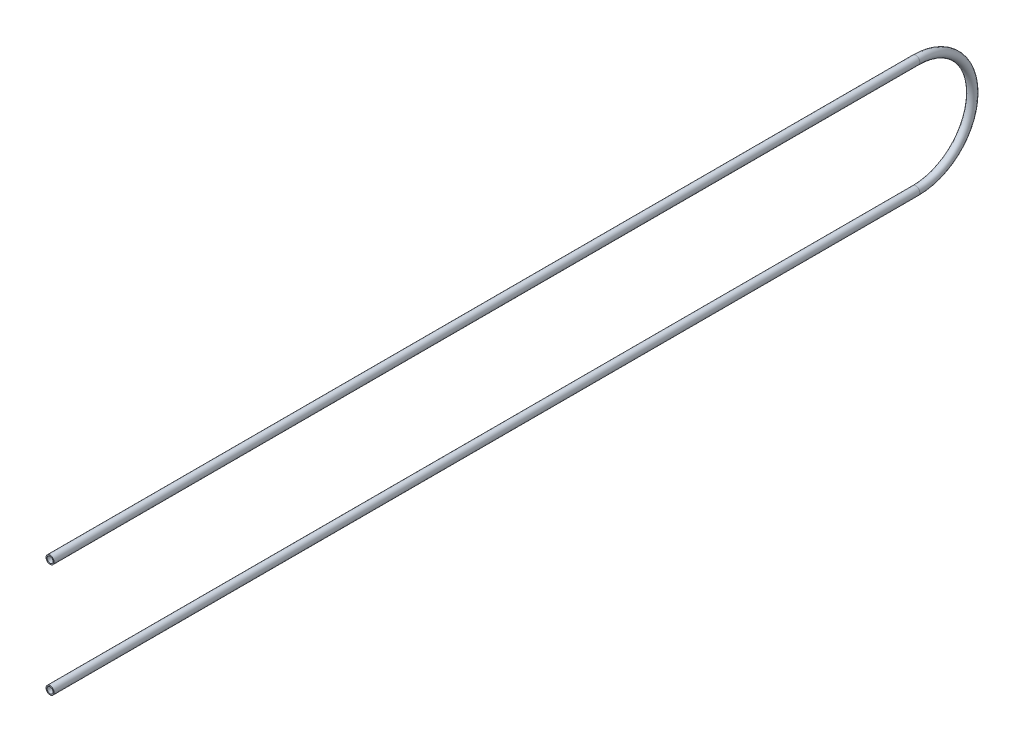
ISO-10303-21;
HEADER;
FILE_DESCRIPTION(('STEP AP214'),'2;1');
FILE_NAME('part.step','',(''),(''),'','','');
FILE_SCHEMA(('AUTOMOTIVE_DESIGN { 1 0 10303 214 1 1 1 1 }'));
ENDSEC;
DATA;
#1=APPLICATION_CONTEXT('core data for automotive mechanical design processes');
#2=APPLICATION_PROTOCOL_DEFINITION('international standard','automotive_design',2000,#1);
#3=PRODUCT_CONTEXT('',#1,'mechanical');
#4=PRODUCT('Part','Part','',(#3));
#5=PRODUCT_RELATED_PRODUCT_CATEGORY('part','',(#4));
#6=PRODUCT_DEFINITION_FORMATION('','',#4);
#7=PRODUCT_DEFINITION_CONTEXT('part definition',#1,'design');
#8=PRODUCT_DEFINITION('design','',#6,#7);
#9=PRODUCT_DEFINITION_SHAPE('','',#8);
#10=(LENGTH_UNIT() NAMED_UNIT(*) SI_UNIT(.MILLI.,.METRE.));
#11=(NAMED_UNIT(*) PLANE_ANGLE_UNIT() SI_UNIT($,.RADIAN.));
#12=(NAMED_UNIT(*) SI_UNIT($,.STERADIAN.) SOLID_ANGLE_UNIT());
#13=UNCERTAINTY_MEASURE_WITH_UNIT(LENGTH_MEASURE(1.E-05),#10,'distance_accuracy_value','');
#14=(GEOMETRIC_REPRESENTATION_CONTEXT(3) GLOBAL_UNCERTAINTY_ASSIGNED_CONTEXT((#13)) GLOBAL_UNIT_ASSIGNED_CONTEXT((#10,
#11,#12)) REPRESENTATION_CONTEXT('',''));
#15=CARTESIAN_POINT('',(0.,0.,0.));
#16=DIRECTION('',(0.,0.,1.));
#17=DIRECTION('',(1.,0.,0.));
#18=AXIS2_PLACEMENT_3D('',#15,#16,#17);
#19=CARTESIAN_POINT('',(0.,-149.225,0.));
#20=DIRECTION('',(0.,0.,-1.));
#21=DIRECTION('',(-1.,0.,0.));
#22=AXIS2_PLACEMENT_3D('',#19,#20,#21);
#23=CYLINDRICAL_SURFACE('',#22,10.668);
#24=CARTESIAN_POINT('',(0.,-149.225,-2286.));
#25=DIRECTION('',(0.,0.,-1.));
#26=DIRECTION('',(1.,0.,0.));
#27=AXIS2_PLACEMENT_3D('',#24,#25,#26);
#28=CIRCLE('',#27,10.668);
#29=CARTESIAN_POINT('',(0.,-159.893,-2286.));
#30=VERTEX_POINT('',#29);
#31=EDGE_CURVE('E79',#30,#30,#28,.T.);
#32=ORIENTED_EDGE('',*,*,#31,.F.);
#33=EDGE_LOOP('',(#32));
#34=FACE_BOUND('',#33,.T.);
#35=CARTESIAN_POINT('',(0.,-149.225,0.));
#36=DIRECTION('',(0.,0.,-1.));
#37=DIRECTION('',(1.,0.,0.));
#38=AXIS2_PLACEMENT_3D('',#35,#36,#37);
#39=CIRCLE('',#38,10.668);
#40=CARTESIAN_POINT('',(10.668,-149.225,0.));
#41=VERTEX_POINT('',#40);
#42=EDGE_CURVE('E48',#41,#41,#39,.T.);
#43=ORIENTED_EDGE('',*,*,#42,.T.);
#44=EDGE_LOOP('',(#43));
#45=FACE_BOUND('',#44,.T.);
#46=ADVANCED_FACE('F33',(#34,#45),#23,.T.);
#47=CARTESIAN_POINT('',(0.,0.,-2286.));
#48=DIRECTION('',(1.,0.,0.));
#49=DIRECTION('',(0.,0.,-1.));
#50=AXIS2_PLACEMENT_3D('',#47,#48,#49);
#51=TOROIDAL_SURFACE('',#50,149.225,10.668);
#52=CARTESIAN_POINT('',(0.,149.225,-2286.));
#53=DIRECTION('',(0.,0.,1.));
#54=DIRECTION('',(1.,0.,0.));
#55=AXIS2_PLACEMENT_3D('',#52,#53,#54);
#56=CIRCLE('',#55,10.668);
#57=CARTESIAN_POINT('',(0.,159.893,-2286.));
#58=VERTEX_POINT('',#57);
#59=EDGE_CURVE('E37',#58,#58,#56,.T.);
#60=CARTESIAN_POINT('',(0.,0.,-2286.));
#61=DIRECTION('',(1.,0.,0.));
#62=DIRECTION('',(0.,0.,-1.));
#63=AXIS2_PLACEMENT_3D('',#60,#61,#62);
#64=CIRCLE('',#63,159.893);
#65=EDGE_CURVE('',#30,#58,#64,.T.);
#66=ORIENTED_EDGE('',*,*,#31,.T.);
#67=ORIENTED_EDGE('',*,*,#59,.F.);
#68=ORIENTED_EDGE('',*,*,#65,.T.);
#69=ORIENTED_EDGE('',*,*,#65,.F.);
#70=EDGE_LOOP('',(#66,#68,#67,#69));
#71=FACE_BOUND('',#70,.T.);
#72=ADVANCED_FACE('F87',(#71),#51,.T.);
#73=CARTESIAN_POINT('',(0.,149.225,-2286.));
#74=DIRECTION('',(0.,0.,1.));
#75=DIRECTION('',(1.,0.,0.));
#76=AXIS2_PLACEMENT_3D('',#73,#74,#75);
#77=CYLINDRICAL_SURFACE('',#76,10.668);
#78=CARTESIAN_POINT('',(0.,149.225,0.));
#79=DIRECTION('',(0.,0.,1.));
#80=DIRECTION('',(1.,0.,0.));
#81=AXIS2_PLACEMENT_3D('',#78,#79,#80);
#82=CIRCLE('',#81,10.668);
#83=CARTESIAN_POINT('',(10.668,149.225,0.));
#84=VERTEX_POINT('',#83);
#85=EDGE_CURVE('E53',#84,#84,#82,.T.);
#86=ORIENTED_EDGE('',*,*,#85,.F.);
#87=EDGE_LOOP('',(#86));
#88=FACE_BOUND('',#87,.T.);
#89=ORIENTED_EDGE('',*,*,#59,.T.);
#90=EDGE_LOOP('',(#89));
#91=FACE_BOUND('',#90,.T.);
#92=ADVANCED_FACE('F35',(#88,#91),#77,.T.);
#93=CARTESIAN_POINT('',(0.,-149.225,0.));
#94=DIRECTION('',(0.,0.,-1.));
#95=DIRECTION('',(1.,0.,0.));
#96=AXIS2_PLACEMENT_3D('',#93,#94,#95);
#97=PLANE('',#96);
#98=CARTESIAN_POINT('',(0.,-149.225,0.));
#99=DIRECTION('',(0.,0.,-1.));
#100=DIRECTION('',(1.,0.,0.));
#101=AXIS2_PLACEMENT_3D('',#98,#99,#100);
#102=CIRCLE('',#101,7.8994);
#103=CARTESIAN_POINT('',(7.8994,-149.225,0.));
#104=VERTEX_POINT('',#103);
#105=EDGE_CURVE('E74',#104,#104,#102,.F.);
#106=ORIENTED_EDGE('',*,*,#105,.F.);
#107=EDGE_LOOP('',(#106));
#108=FACE_BOUND('',#107,.T.);
#109=ORIENTED_EDGE('',*,*,#42,.F.);
#110=EDGE_LOOP('',(#109));
#111=FACE_BOUND('',#110,.T.);
#112=ADVANCED_FACE('F93',(#108,#111),#97,.F.);
#113=CARTESIAN_POINT('',(0.,149.225,0.));
#114=DIRECTION('',(0.,0.,1.));
#115=DIRECTION('',(1.,0.,0.));
#116=AXIS2_PLACEMENT_3D('',#113,#114,#115);
#117=PLANE('',#116);
#118=CARTESIAN_POINT('',(0.,149.225,0.));
#119=DIRECTION('',(0.,0.,1.));
#120=DIRECTION('',(1.,0.,0.));
#121=AXIS2_PLACEMENT_3D('',#118,#119,#120);
#122=CIRCLE('',#121,7.8994);
#123=CARTESIAN_POINT('',(7.8994,149.225,0.));
#124=VERTEX_POINT('',#123);
#125=EDGE_CURVE('E11',#124,#124,#122,.F.);
#126=ORIENTED_EDGE('',*,*,#125,.T.);
#127=EDGE_LOOP('',(#126));
#128=FACE_BOUND('',#127,.T.);
#129=ORIENTED_EDGE('',*,*,#85,.T.);
#130=EDGE_LOOP('',(#129));
#131=FACE_BOUND('',#130,.T.);
#132=ADVANCED_FACE('F60',(#128,#131),#117,.T.);
#133=CARTESIAN_POINT('',(0.,-149.225,0.));
#134=DIRECTION('',(0.,0.,-1.));
#135=DIRECTION('',(-1.,0.,0.));
#136=AXIS2_PLACEMENT_3D('',#133,#134,#135);
#137=CYLINDRICAL_SURFACE('',#136,7.8994);
#138=CARTESIAN_POINT('',(0.,-149.225,-2286.));
#139=DIRECTION('',(0.,0.,-1.));
#140=DIRECTION('',(1.,0.,0.));
#141=AXIS2_PLACEMENT_3D('',#138,#139,#140);
#142=CIRCLE('',#141,7.8994);
#143=CARTESIAN_POINT('',(0.,-157.1244,-2286.));
#144=VERTEX_POINT('',#143);
#145=EDGE_CURVE('E71',#144,#144,#142,.F.);
#146=ORIENTED_EDGE('',*,*,#145,.F.);
#147=EDGE_LOOP('',(#146));
#148=FACE_BOUND('',#147,.T.);
#149=ORIENTED_EDGE('',*,*,#105,.T.);
#150=EDGE_LOOP('',(#149));
#151=FACE_BOUND('',#150,.T.);
#152=ADVANCED_FACE('F101',(#148,#151),#137,.F.);
#153=CARTESIAN_POINT('',(0.,0.,-2286.));
#154=DIRECTION('',(1.,0.,0.));
#155=DIRECTION('',(0.,0.,-1.));
#156=AXIS2_PLACEMENT_3D('',#153,#154,#155);
#157=TOROIDAL_SURFACE('',#156,149.225,7.8994);
#158=CARTESIAN_POINT('',(0.,149.225,-2286.));
#159=DIRECTION('',(0.,0.,1.));
#160=DIRECTION('',(1.,0.,0.));
#161=AXIS2_PLACEMENT_3D('',#158,#159,#160);
#162=CIRCLE('',#161,7.8994);
#163=CARTESIAN_POINT('',(0.,157.1244,-2286.));
#164=VERTEX_POINT('',#163);
#165=EDGE_CURVE('E42',#164,#164,#162,.F.);
#166=CARTESIAN_POINT('',(0.,0.,-2286.));
#167=DIRECTION('',(1.,0.,0.));
#168=DIRECTION('',(0.,0.,-1.));
#169=AXIS2_PLACEMENT_3D('',#166,#167,#168);
#170=CIRCLE('',#169,157.1244);
#171=EDGE_CURVE('',#144,#164,#170,.T.);
#172=ORIENTED_EDGE('',*,*,#145,.T.);
#173=ORIENTED_EDGE('',*,*,#165,.F.);
#174=ORIENTED_EDGE('',*,*,#171,.T.);
#175=ORIENTED_EDGE('',*,*,#171,.F.);
#176=EDGE_LOOP('',(#172,#174,#173,#175));
#177=FACE_BOUND('',#176,.T.);
#178=ADVANCED_FACE('F66',(#177),#157,.F.);
#179=CARTESIAN_POINT('',(0.,149.225,-2286.));
#180=DIRECTION('',(0.,0.,1.));
#181=DIRECTION('',(1.,0.,0.));
#182=AXIS2_PLACEMENT_3D('',#179,#180,#181);
#183=CYLINDRICAL_SURFACE('',#182,7.8994);
#184=ORIENTED_EDGE('',*,*,#125,.F.);
#185=EDGE_LOOP('',(#184));
#186=FACE_BOUND('',#185,.T.);
#187=ORIENTED_EDGE('',*,*,#165,.T.);
#188=EDGE_LOOP('',(#187));
#189=FACE_BOUND('',#188,.T.);
#190=ADVANCED_FACE('F63',(#186,#189),#183,.F.);
#191=CLOSED_SHELL('',(#46,#72,#92,#112,#132,#152,#178,#190));
#192=MANIFOLD_SOLID_BREP('B2',#191);
#193=ADVANCED_BREP_SHAPE_REPRESENTATION('',(#18,#192),#14);
#194=SHAPE_DEFINITION_REPRESENTATION(#9,#193);
ENDSEC;
END-ISO-10303-21;
